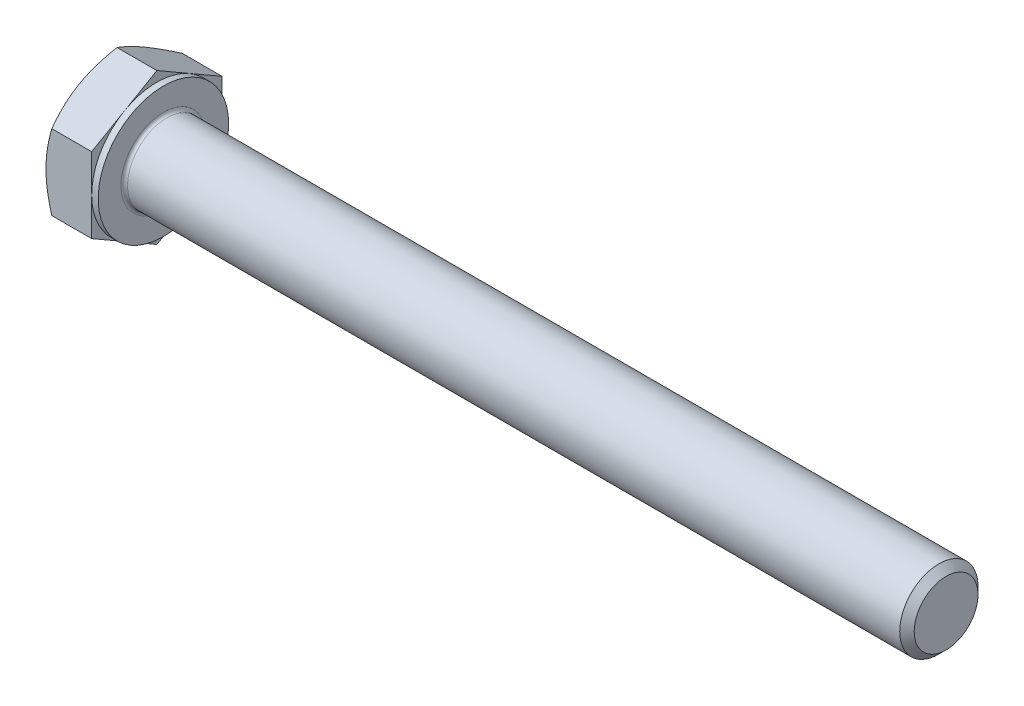
ISO-10303-21;
HEADER;
FILE_DESCRIPTION(('STEP AP214'),'2;1');
FILE_NAME('part.step','',(''),(''),'','','');
FILE_SCHEMA(('AUTOMOTIVE_DESIGN { 1 0 10303 214 1 1 1 1 }'));
ENDSEC;
DATA;
#1=APPLICATION_CONTEXT('core data for automotive mechanical design processes');
#2=APPLICATION_PROTOCOL_DEFINITION('international standard','automotive_design',2000,#1);
#3=PRODUCT_CONTEXT('',#1,'mechanical');
#4=PRODUCT('Part','Part','',(#3));
#5=PRODUCT_RELATED_PRODUCT_CATEGORY('part','',(#4));
#6=PRODUCT_DEFINITION_FORMATION('','',#4);
#7=PRODUCT_DEFINITION_CONTEXT('part definition',#1,'design');
#8=PRODUCT_DEFINITION('design','',#6,#7);
#9=PRODUCT_DEFINITION_SHAPE('','',#8);
#10=(LENGTH_UNIT() NAMED_UNIT(*) SI_UNIT(.MILLI.,.METRE.));
#11=(NAMED_UNIT(*) PLANE_ANGLE_UNIT() SI_UNIT($,.RADIAN.));
#12=(NAMED_UNIT(*) SI_UNIT($,.STERADIAN.) SOLID_ANGLE_UNIT());
#13=UNCERTAINTY_MEASURE_WITH_UNIT(LENGTH_MEASURE(1.E-05),#10,'distance_accuracy_value','');
#14=(GEOMETRIC_REPRESENTATION_CONTEXT(3) GLOBAL_UNCERTAINTY_ASSIGNED_CONTEXT((#13)) GLOBAL_UNIT_ASSIGNED_CONTEXT((#10,
#11,#12)) REPRESENTATION_CONTEXT('',''));
#15=CARTESIAN_POINT('',(0.,0.,0.));
#16=DIRECTION('',(0.,0.,1.));
#17=DIRECTION('',(1.,0.,0.));
#18=AXIS2_PLACEMENT_3D('',#15,#16,#17);
#19=CARTESIAN_POINT('',(4.,5.77350269189626,0.));
#20=DIRECTION('',(1.,0.,0.));
#21=DIRECTION('',(0.,0.,-1.));
#22=AXIS2_PLACEMENT_3D('',#19,#20,#21);
#23=PLANE('',#22);
#24=CARTESIAN_POINT('',(4.,0.,0.));
#25=DIRECTION('',(1.,0.,0.));
#26=DIRECTION('',(0.,0.,-1.));
#27=AXIS2_PLACEMENT_3D('',#24,#25,#26);
#28=CIRCLE('',#27,3.25);
#29=CARTESIAN_POINT('',(4.,0.,-3.25));
#30=VERTEX_POINT('',#29);
#31=EDGE_CURVE('E43',#30,#30,#28,.F.);
#32=ORIENTED_EDGE('',*,*,#31,.T.);
#33=EDGE_LOOP('',(#32));
#34=FACE_BOUND('',#33,.T.);
#35=CARTESIAN_POINT('',(4.,0.,0.));
#36=DIRECTION('',(1.,0.,0.));
#37=DIRECTION('',(0.,0.,-1.));
#38=AXIS2_PLACEMENT_3D('',#35,#36,#37);
#39=CIRCLE('',#38,5.);
#40=CARTESIAN_POINT('',(4.,0.,-5.));
#41=VERTEX_POINT('',#40);
#42=EDGE_CURVE('E300',#41,#41,#39,.T.);
#43=ORIENTED_EDGE('',*,*,#42,.T.);
#44=EDGE_LOOP('',(#43));
#45=FACE_BOUND('',#44,.T.);
#46=ADVANCED_FACE('F35',(#34,#45),#23,.T.);
#47=CARTESIAN_POINT('',(0.,0.,0.));
#48=DIRECTION('',(-1.,0.,0.));
#49=DIRECTION('',(0.,0.,1.));
#50=AXIS2_PLACEMENT_3D('',#47,#48,#49);
#51=CYLINDRICAL_SURFACE('',#50,3.);
#52=CARTESIAN_POINT('',(4.25,0.,0.));
#53=DIRECTION('',(1.,0.,0.));
#54=DIRECTION('',(0.,0.,-1.));
#55=AXIS2_PLACEMENT_3D('',#52,#53,#54);
#56=CIRCLE('',#55,3.);
#57=CARTESIAN_POINT('',(4.25,0.,-3.));
#58=VERTEX_POINT('',#57);
#59=EDGE_CURVE('E11',#58,#58,#56,.T.);
#60=ORIENTED_EDGE('',*,*,#59,.T.);
#61=EDGE_LOOP('',(#60));
#62=FACE_BOUND('',#61,.T.);
#63=CARTESIAN_POINT('',(63.4455,0.,0.));
#64=DIRECTION('',(-1.,0.,0.));
#65=DIRECTION('',(0.,0.,1.));
#66=AXIS2_PLACEMENT_3D('',#63,#64,#65);
#67=CIRCLE('',#66,3.);
#68=CARTESIAN_POINT('',(63.4455,0.,3.));
#69=VERTEX_POINT('',#68);
#70=EDGE_CURVE('E279',#69,#69,#67,.T.);
#71=ORIENTED_EDGE('',*,*,#70,.T.);
#72=EDGE_LOOP('',(#71));
#73=FACE_BOUND('',#72,.T.);
#74=ADVANCED_FACE('F253',(#62,#73),#51,.T.);
#75=CARTESIAN_POINT('',(64.,0.,0.));
#76=DIRECTION('',(-1.,0.,0.));
#77=DIRECTION('',(0.,0.,1.));
#78=AXIS2_PLACEMENT_3D('',#75,#76,#77);
#79=CONICAL_SURFACE('',#78,2.4455,0.785398163397449);
#80=ORIENTED_EDGE('',*,*,#70,.F.);
#81=EDGE_LOOP('',(#80));
#82=FACE_BOUND('',#81,.T.);
#83=CARTESIAN_POINT('',(64.,0.,0.));
#84=DIRECTION('',(-1.,0.,0.));
#85=DIRECTION('',(0.,0.,1.));
#86=AXIS2_PLACEMENT_3D('',#83,#84,#85);
#87=CIRCLE('',#86,2.4455);
#88=CARTESIAN_POINT('',(64.,0.,2.4455));
#89=VERTEX_POINT('',#88);
#90=EDGE_CURVE('E277',#89,#89,#87,.T.);
#91=ORIENTED_EDGE('',*,*,#90,.T.);
#92=EDGE_LOOP('',(#91));
#93=FACE_BOUND('',#92,.T.);
#94=ADVANCED_FACE('F258',(#82,#93),#79,.T.);
#95=CARTESIAN_POINT('',(64.,0.,0.));
#96=DIRECTION('',(-1.,0.,0.));
#97=DIRECTION('',(0.,0.,1.));
#98=AXIS2_PLACEMENT_3D('',#95,#96,#97);
#99=PLANE('',#98);
#100=ORIENTED_EDGE('',*,*,#90,.F.);
#101=EDGE_LOOP('',(#100));
#102=FACE_BOUND('',#101,.T.);
#103=ADVANCED_FACE('F265',(#102),#99,.F.);
#104=CARTESIAN_POINT('',(3.5,5.,0.));
#105=DIRECTION('',(1.,0.,0.));
#106=DIRECTION('',(0.,0.,-1.));
#107=AXIS2_PLACEMENT_3D('',#104,#105,#106);
#108=PLANE('',#107);
#109=DIRECTION('',(0.,0.500000000000001,0.866025403784438));
#110=VECTOR('',#109,1.);
#111=CARTESIAN_POINT('',(3.5,2.88675134594813,-5.));
#112=LINE('',#111,#110);
#113=CARTESIAN_POINT('',(3.5,2.88675134594813,-5.));
#114=VERTEX_POINT('',#113);
#115=CARTESIAN_POINT('',(3.5,4.33012701892219,-2.50000000000001));
#116=VERTEX_POINT('',#115);
#117=EDGE_CURVE('E167',#114,#116,#112,.T.);
#118=ORIENTED_EDGE('',*,*,#117,.T.);
#119=CARTESIAN_POINT('',(3.5,0.,0.));
#120=DIRECTION('',(-1.,0.,0.));
#121=DIRECTION('',(0.,0.,1.));
#122=AXIS2_PLACEMENT_3D('',#119,#120,#121);
#123=CIRCLE('',#122,5.);
#124=CARTESIAN_POINT('',(3.5,0.,-5.));
#125=VERTEX_POINT('',#124);
#126=EDGE_CURVE('E50',#116,#125,#123,.T.);
#127=ORIENTED_EDGE('',*,*,#126,.T.);
#128=DIRECTION('',(0.,1.,0.));
#129=VECTOR('',#128,1.);
#130=CARTESIAN_POINT('',(3.5,2.88675134594813,-5.));
#131=LINE('',#130,#129);
#132=EDGE_CURVE('E303',#125,#114,#131,.T.);
#133=ORIENTED_EDGE('',*,*,#132,.T.);
#134=EDGE_LOOP('',(#118,#127,#133));
#135=FACE_BOUND('',#134,.T.);
#136=ADVANCED_FACE('F268',(#135),#108,.T.);
#137=CARTESIAN_POINT('',(3.5,5.77350269189626,0.));
#138=VERTEX_POINT('',#137);
#139=EDGE_CURVE('E165',#116,#138,#112,.T.);
#140=ORIENTED_EDGE('',*,*,#139,.T.);
#141=DIRECTION('',(0.,-0.500000000000001,0.866025403784438));
#142=VECTOR('',#141,1.);
#143=CARTESIAN_POINT('',(3.5,5.77350269189626,0.));
#144=LINE('',#143,#142);
#145=CARTESIAN_POINT('',(3.5,4.33012701892219,2.5));
#146=VERTEX_POINT('',#145);
#147=EDGE_CURVE('E164',#138,#146,#144,.T.);
#148=ORIENTED_EDGE('',*,*,#147,.T.);
#149=EDGE_CURVE('E153',#146,#116,#123,.T.);
#150=ORIENTED_EDGE('',*,*,#149,.T.);
#151=EDGE_LOOP('',(#140,#148,#150));
#152=FACE_BOUND('',#151,.T.);
#153=ADVANCED_FACE('F273',(#152),#108,.T.);
#154=CARTESIAN_POINT('',(3.5,2.88675134594813,5.));
#155=VERTEX_POINT('',#154);
#156=EDGE_CURVE('E132',#146,#155,#144,.T.);
#157=ORIENTED_EDGE('',*,*,#156,.T.);
#158=DIRECTION('',(0.,-1.,0.));
#159=VECTOR('',#158,1.);
#160=CARTESIAN_POINT('',(3.5,2.88675134594813,5.));
#161=LINE('',#160,#159);
#162=CARTESIAN_POINT('',(3.5,0.,5.));
#163=VERTEX_POINT('',#162);
#164=EDGE_CURVE('E126',#155,#163,#161,.T.);
#165=ORIENTED_EDGE('',*,*,#164,.T.);
#166=EDGE_CURVE('E130',#163,#146,#123,.T.);
#167=ORIENTED_EDGE('',*,*,#166,.T.);
#168=EDGE_LOOP('',(#157,#165,#167));
#169=FACE_BOUND('',#168,.T.);
#170=ADVANCED_FACE('F128',(#169),#108,.T.);
#171=CARTESIAN_POINT('',(3.5,-2.88675134594813,5.));
#172=VERTEX_POINT('',#171);
#173=EDGE_CURVE('E136',#163,#172,#161,.T.);
#174=ORIENTED_EDGE('',*,*,#173,.T.);
#175=DIRECTION('',(0.,-0.500000000000001,-0.866025403784438));
#176=VECTOR('',#175,1.);
#177=CARTESIAN_POINT('',(3.5,-5.77350269189627,0.));
#178=LINE('',#177,#176);
#179=CARTESIAN_POINT('',(3.5,-4.33012701892219,2.5));
#180=VERTEX_POINT('',#179);
#181=EDGE_CURVE('E143',#172,#180,#178,.T.);
#182=ORIENTED_EDGE('',*,*,#181,.T.);
#183=EDGE_CURVE('E140',#180,#163,#123,.T.);
#184=ORIENTED_EDGE('',*,*,#183,.T.);
#185=EDGE_LOOP('',(#174,#182,#184));
#186=FACE_BOUND('',#185,.T.);
#187=ADVANCED_FACE('F141',(#186),#108,.T.);
#188=CARTESIAN_POINT('',(3.5,-5.77350269189627,0.));
#189=VERTEX_POINT('',#188);
#190=EDGE_CURVE('E159',#180,#189,#178,.T.);
#191=ORIENTED_EDGE('',*,*,#190,.T.);
#192=DIRECTION('',(0.,0.5,-0.866025403784438));
#193=VECTOR('',#192,1.);
#194=CARTESIAN_POINT('',(3.5,-2.88675134594814,-5.));
#195=LINE('',#194,#193);
#196=CARTESIAN_POINT('',(3.5,-4.33012701892219,-2.5));
#197=VERTEX_POINT('',#196);
#198=EDGE_CURVE('E341',#189,#197,#195,.T.);
#199=ORIENTED_EDGE('',*,*,#198,.T.);
#200=EDGE_CURVE('E147',#197,#180,#123,.T.);
#201=ORIENTED_EDGE('',*,*,#200,.T.);
#202=EDGE_LOOP('',(#191,#199,#201));
#203=FACE_BOUND('',#202,.T.);
#204=ADVANCED_FACE('F342',(#203),#108,.T.);
#205=CARTESIAN_POINT('',(3.5,-2.88675134594814,-5.));
#206=VERTEX_POINT('',#205);
#207=EDGE_CURVE('E154',#197,#206,#195,.T.);
#208=ORIENTED_EDGE('',*,*,#207,.T.);
#209=EDGE_CURVE('E304',#206,#125,#131,.T.);
#210=ORIENTED_EDGE('',*,*,#209,.T.);
#211=EDGE_CURVE('E311',#125,#197,#123,.T.);
#212=ORIENTED_EDGE('',*,*,#211,.T.);
#213=EDGE_LOOP('',(#208,#210,#212));
#214=FACE_BOUND('',#213,.T.);
#215=ADVANCED_FACE('F274',(#214),#108,.T.);
#216=CARTESIAN_POINT('',(0.,0.,0.));
#217=DIRECTION('',(-1.,0.,0.));
#218=DIRECTION('',(0.,0.,1.));
#219=AXIS2_PLACEMENT_3D('',#216,#217,#218);
#220=CYLINDRICAL_SURFACE('',#219,5.);
#221=ORIENTED_EDGE('',*,*,#126,.F.);
#222=ORIENTED_EDGE('',*,*,#149,.F.);
#223=ORIENTED_EDGE('',*,*,#166,.F.);
#224=ORIENTED_EDGE('',*,*,#183,.F.);
#225=ORIENTED_EDGE('',*,*,#200,.F.);
#226=ORIENTED_EDGE('',*,*,#211,.F.);
#227=EDGE_LOOP('',(#221,#222,#223,#224,#225,#226));
#228=FACE_BOUND('',#227,.T.);
#229=ORIENTED_EDGE('',*,*,#42,.F.);
#230=EDGE_LOOP('',(#229));
#231=FACE_BOUND('',#230,.T.);
#232=ADVANCED_FACE('F150',(#228,#231),#220,.T.);
#233=CARTESIAN_POINT('',(0.,5.77350269189626,0.));
#234=DIRECTION('',(1.,0.,0.));
#235=DIRECTION('',(0.,0.,-1.));
#236=AXIS2_PLACEMENT_3D('',#233,#234,#235);
#237=PLANE('',#236);
#238=CARTESIAN_POINT('',(0.,0.,0.));
#239=DIRECTION('',(1.,0.,0.));
#240=DIRECTION('',(0.,0.,-1.));
#241=AXIS2_PLACEMENT_3D('',#238,#239,#240);
#242=CIRCLE('',#241,5.);
#243=CARTESIAN_POINT('',(0.,0.,-5.));
#244=VERTEX_POINT('',#243);
#245=CARTESIAN_POINT('',(0.,4.33012701892219,-2.50000000000001));
#246=VERTEX_POINT('',#245);
#247=EDGE_CURVE('E299',#244,#246,#242,.T.);
#248=ORIENTED_EDGE('',*,*,#247,.F.);
#249=CARTESIAN_POINT('',(0.,-4.33012701892219,-2.5));
#250=VERTEX_POINT('',#249);
#251=EDGE_CURVE('E295',#250,#244,#242,.T.);
#252=ORIENTED_EDGE('',*,*,#251,.F.);
#253=CARTESIAN_POINT('',(0.,-4.33012701892219,2.5));
#254=VERTEX_POINT('',#253);
#255=EDGE_CURVE('E298',#254,#250,#242,.T.);
#256=ORIENTED_EDGE('',*,*,#255,.F.);
#257=CARTESIAN_POINT('',(0.,0.,5.));
#258=VERTEX_POINT('',#257);
#259=EDGE_CURVE('E334',#258,#254,#242,.T.);
#260=ORIENTED_EDGE('',*,*,#259,.F.);
#261=CARTESIAN_POINT('',(0.,0.,0.));
#262=DIRECTION('',(-1.,0.,0.));
#263=DIRECTION('',(0.,0.,1.));
#264=AXIS2_PLACEMENT_3D('',#261,#262,#263);
#265=CIRCLE('',#264,5.);
#266=CARTESIAN_POINT('',(0.,4.33012701892219,2.50000000000001));
#267=VERTEX_POINT('',#266);
#268=EDGE_CURVE('E168',#258,#267,#265,.T.);
#269=ORIENTED_EDGE('',*,*,#268,.T.);
#270=EDGE_CURVE('E357',#246,#267,#242,.T.);
#271=ORIENTED_EDGE('',*,*,#270,.F.);
#272=EDGE_LOOP('',(#248,#252,#256,#260,#269,#271));
#273=FACE_BOUND('',#272,.T.);
#274=ADVANCED_FACE('F199',(#273),#237,.F.);
#275=CARTESIAN_POINT('',(0.,0.,0.));
#276=DIRECTION('',(1.,0.,0.));
#277=DIRECTION('',(0.,0.,-1.));
#278=AXIS2_PLACEMENT_3D('',#275,#276,#277);
#279=CONICAL_SURFACE('',#278,5.,1.0471975511966);
#280=CARTESIAN_POINT('',(0.446648656051823,2.88663587589429,5.0002));
#281=CARTESIAN_POINT('',(0.373386567637631,3.01349970319368,4.78046540547481));
#282=CARTESIAN_POINT('',(0.306751321918088,3.14144859993849,4.55885141554042));
#283=CARTESIAN_POINT('',(0.190438991010808,3.39956193532121,4.11178600454649));
#284=CARTESIAN_POINT('',(0.140803049915787,3.52973095989718,3.88632664040923));
#285=CARTESIAN_POINT('',(0.0635510254186976,3.78847564779797,3.43816769477649));
#286=CARTESIAN_POINT('',(0.0354203782834899,3.91701101576052,3.21553790689581));
#287=CARTESIAN_POINT('',(0.0101949219536849,4.11026620624322,2.88081009815336));
#288=CARTESIAN_POINT('',(0.00461345976948409,4.17472868879311,2.76915780319494));
#289=CARTESIAN_POINT('',(-0.000797783248529528,4.30371322717528,2.54575002932621));
#290=CARTESIAN_POINT('',(-0.000627741741795967,4.36823528110589,2.43399455370969));
#291=CARTESIAN_POINT('',(0.00775363179203772,4.54500768479194,2.12781576914936));
#292=CARTESIAN_POINT('',(0.0218297718972525,4.65719946015293,1.93349391403279));
#293=CARTESIAN_POINT('',(0.0664652571094314,4.88083840557981,1.5461398980023));
#294=CARTESIAN_POINT('',(0.0970398601475083,4.9922847895602,1.35310909862843));
#295=CARTESIAN_POINT('',(0.173468493621164,5.21637431361295,0.964974657525146));
#296=CARTESIAN_POINT('',(0.21964637887868,5.32898917185759,0.769920001358265));
#297=CARTESIAN_POINT('',(0.324451794491934,5.55253939626499,0.382719654641232));
#298=CARTESIAN_POINT('',(0.383054703437374,5.66347762579592,0.190569004591914));
#299=CARTESIAN_POINT('',(0.446648656051827,5.7736181619501,-0.000199999999999513));
#300=B_SPLINE_CURVE_WITH_KNOTS('',3,(#280,#281,#282,#283,#284,#285,#286,#287,#288,#289,#290,
#291,#292,#293,#294,#295,#296,#297,#298,#299),.UNSPECIFIED.,.F.,.F.,(4,2,2,2,2,2,2,2,2,4),(0.,
0.79255584136309,1.58701660053333,2.3618153748728,2.74884076077325,3.13585419177294,
3.80962362599679,4.48401723901189,5.17336882348929,5.86136694793725),.UNSPECIFIED.);
#301=CARTESIAN_POINT('',(0.446581987385201,5.77350269189626,0.));
#302=VERTEX_POINT('',#301);
#303=EDGE_CURVE('E219',#267,#302,#300,.T.);
#304=ORIENTED_EDGE('',*,*,#303,.T.);
#305=CARTESIAN_POINT('',(0.446648656051827,5.7736181619501,0.000200000000000224));
#306=CARTESIAN_POINT('',(0.373386567637634,5.64675433465071,-0.219534594525185));
#307=CARTESIAN_POINT('',(0.306751321918092,5.5188054379059,-0.44114858445958));
#308=CARTESIAN_POINT('',(0.190438991010811,5.26069210252318,-0.888213995453512));
#309=CARTESIAN_POINT('',(0.140803049915789,5.13052307794721,-1.11367335959077));
#310=CARTESIAN_POINT('',(0.0635510254186983,4.87177839004641,-1.56183230522351));
#311=CARTESIAN_POINT('',(0.0354203782834894,4.74324302208387,-1.78446209310419));
#312=CARTESIAN_POINT('',(0.010194921953685,4.54998783160116,-2.11918990184664));
#313=CARTESIAN_POINT('',(0.00461345976948478,4.48552534905128,-2.23084219680506));
#314=CARTESIAN_POINT('',(-0.000797783248528973,4.35654081066911,-2.4542499706738));
#315=CARTESIAN_POINT('',(-0.000627741741796177,4.2920187567385,-2.56600544629031));
#316=CARTESIAN_POINT('',(0.00775363179203636,4.11524635305244,-2.87218423085064));
#317=CARTESIAN_POINT('',(0.0218297718972514,4.00305457769146,-3.06650608596721));
#318=CARTESIAN_POINT('',(0.0664652571094302,3.77941563226457,-3.4538601019977));
#319=CARTESIAN_POINT('',(0.0970398601475068,3.66796924828418,-3.64689090137157));
#320=CARTESIAN_POINT('',(0.173468493621161,3.44387972423144,-4.03502534247485));
#321=CARTESIAN_POINT('',(0.219646378878677,3.3312648659868,-4.23007999864173));
#322=CARTESIAN_POINT('',(0.32445179449193,3.1077146415794,-4.61728034535877));
#323=CARTESIAN_POINT('',(0.38305470343737,2.99677641204847,-4.80943099540809));
#324=CARTESIAN_POINT('',(0.446648656051824,2.88663587589429,-5.0002));
#325=B_SPLINE_CURVE_WITH_KNOTS('',3,(#305,#306,#307,#308,#309,#310,#311,#312,#313,#314,#315,
#316,#317,#318,#319,#320,#321,#322,#323,#324),.UNSPECIFIED.,.F.,.F.,(4,2,2,2,2,2,2,2,2,4),(0.,
0.79255584136309,1.58701660053333,2.3618153748728,2.74884076077325,3.13585419177295,
3.80962362599679,4.48401723901189,5.17336882348929,5.86136694793726),.UNSPECIFIED.);
#326=EDGE_CURVE('E58',#302,#246,#325,.T.);
#327=ORIENTED_EDGE('',*,*,#326,.T.);
#328=ORIENTED_EDGE('',*,*,#270,.T.);
#329=EDGE_LOOP('',(#304,#327,#328));
#330=FACE_BOUND('',#329,.T.);
#331=ADVANCED_FACE('F358',(#330),#279,.T.);
#332=CARTESIAN_POINT('',(2.47533544773016,-7.82661640485966,5.));
#333=CARTESIAN_POINT('',(2.36879683587998,-7.60758613191208,5.));
#334=CARTESIAN_POINT('',(2.26325911909788,-7.38806071524903,5.));
#335=CARTESIAN_POINT('',(2.05474707935714,-6.94775649684319,5.));
#336=CARTESIAN_POINT('',(1.95177314683289,-6.72697751040762,5.));
#337=CARTESIAN_POINT('',(1.74844778604607,-6.28280027256957,5.));
#338=CARTESIAN_POINT('',(1.64811306546723,-6.05939434718172,5.));
#339=CARTESIAN_POINT('',(1.45145486053268,-5.61083043946536,5.));
#340=CARTESIAN_POINT('',(1.35513119126153,-5.38567253847478,5.));
#341=CARTESIAN_POINT('',(1.16445037644561,-4.92576614875537,5.));
#342=CARTESIAN_POINT('',(1.07026351441087,-4.69094667948418,5.));
#343=CARTESIAN_POINT('',(0.888844387633465,-4.2185875281139,5.));
#344=CARTESIAN_POINT('',(0.801612892890078,-3.9810475481584,5.));
#345=CARTESIAN_POINT('',(0.636341072069418,-3.50329086460758,5.));
#346=CARTESIAN_POINT('',(0.558282765305849,-3.26308044300256,5.));
#347=CARTESIAN_POINT('',(0.413813856838626,-2.77921467855872,5.));
#348=CARTESIAN_POINT('',(0.347399663707796,-2.53556042305535,5.));
#349=CARTESIAN_POINT('',(0.229707450560146,-2.04600448324933,5.));
#350=CARTESIAN_POINT('',(0.178346573443936,-1.80012308688265,5.));
#351=CARTESIAN_POINT('',(0.0936230804633171,-1.305228374755,5.));
#352=CARTESIAN_POINT('',(0.0602585788862647,-1.05621538993014,5.));
#353=CARTESIAN_POINT('',(0.0146229933450849,-0.559584253278234,5.));
#354=CARTESIAN_POINT('',(0.00207498504095111,-0.311992192358639,5.));
#355=CARTESIAN_POINT('',(-0.00159747163599464,0.183375584872585,5.));
#356=CARTESIAN_POINT('',(0.00727849452386872,0.431151304645096,5.));
#357=CARTESIAN_POINT('',(0.0397265054214764,0.849622861805588,5.));
#358=CARTESIAN_POINT('',(0.0579847913857282,1.02075746651638,5.));
#359=CARTESIAN_POINT('',(0.103624050167705,1.36181398870371,5.));
#360=CARTESIAN_POINT('',(0.131006199278084,1.53173574692745,5.));
#361=CARTESIAN_POINT('',(0.225403334084524,2.03942834664788,5.));
#362=CARTESIAN_POINT('',(0.304653621421581,2.37495177296714,5.));
#363=CARTESIAN_POINT('',(0.442611792559001,2.87686006155706,5.));
#364=CARTESIAN_POINT('',(0.492453036342918,3.0458304872064,5.));
#365=CARTESIAN_POINT('',(0.597441969943079,3.38213061181746,5.));
#366=CARTESIAN_POINT('',(0.652589699263441,3.54946029855449,5.));
#367=CARTESIAN_POINT('',(0.767295730539581,3.88253122492364,5.));
#368=CARTESIAN_POINT('',(0.826852713693849,4.04827292290385,5.));
#369=CARTESIAN_POINT('',(0.949663499710998,4.37837269762153,5.));
#370=CARTESIAN_POINT('',(1.01291722698938,4.5427308025697,5.));
#371=CARTESIAN_POINT('',(1.18384085372924,4.97467594201679,5.));
#372=CARTESIAN_POINT('',(1.29410564850766,5.24123504417617,5.));
#373=CARTESIAN_POINT('',(1.5208504127353,5.7717060368554,5.));
#374=CARTESIAN_POINT('',(1.63733099875865,6.03561766166312,5.));
#375=CARTESIAN_POINT('',(1.87507624465413,6.56138078935165,5.));
#376=CARTESIAN_POINT('',(1.99634255400967,6.82323154395422,5.));
#377=CARTESIAN_POINT('',(2.24254703935561,7.34518395756717,5.));
#378=CARTESIAN_POINT('',(2.36748508274945,7.60528567932421,5.));
#379=CARTESIAN_POINT('',(2.62044102963033,8.12446478812678,5.));
#380=CARTESIAN_POINT('',(2.74846325137577,8.38354006704556,5.));
#381=CARTESIAN_POINT('',(3.00682669043526,8.90053291278444,5.));
#382=CARTESIAN_POINT('',(3.13716793150619,9.15845046771046,5.));
#383=CARTESIAN_POINT('',(3.5309242466802,9.93067662423608,5.));
#384=CARTESIAN_POINT('',(3.79712405249166,10.443564725279,5.));
#385=CARTESIAN_POINT('',(4.30724046958685,11.4147548726185,5.));
#386=CARTESIAN_POINT('',(4.55067498840221,11.8733113497711,5.));
#387=CARTESIAN_POINT('',(5.04052915864101,12.7888590482936,5.));
#388=CARTESIAN_POINT('',(5.28694897561914,13.2458501810352,5.));
#389=CARTESIAN_POINT('',(5.78122505426355,14.1571829404852,5.));
#390=CARTESIAN_POINT('',(6.02907430541541,14.6115283754435,5.));
#391=CARTESIAN_POINT('',(6.52648185600864,15.519239876133,5.));
#392=CARTESIAN_POINT('',(6.77604002891257,15.9726060111757,5.));
#393=CARTESIAN_POINT('',(7.02622264640791,16.4256251058944,4.99999999999999));
#394=B_SPLINE_CURVE_WITH_KNOTS('',3,(#332,#333,#334,#335,#336,#337,#338,#339,#340,#341,#342,
#343,#344,#345,#346,#347,#348,#349,#350,#351,#352,#353,#354,#355,#356,#357,#358,#359,#360,#361,
#362,#363,#364,#365,#366,#367,#368,#369,#370,#371,#372,#373,#374,#375,#376,#377,#378,#379,#380,
#381,#382,#383,#384,#385,#386,#387,#388,#389,#390,#391,#392,#393),.UNSPECIFIED.,.F.,.F.,(4,2,2,
2,2,2,2,2,2,2,2,2,2,2,2,2,2,2,2,2,2,2,2,2,2,2,2,2,2,2,4),(0.,0.730708682345172,1.46152797074168,
2.19620403713772,2.93084619629067,3.6897749176122,4.4487875404052,5.20628666357255,
5.96355173652935,6.71656679685729,7.4695029387385,8.21233991499823,8.95519126453254,
9.4712599153487,9.98739512599664,11.0201893970363,11.5486465448551,12.0771076270762,
12.6054112809942,13.1337041368682,13.9989833756252,14.8643486057043,15.7300147495654,
16.5956496701284,17.4625765104336,18.329512236973,20.0630293199505,21.6205191254926,
23.178095703244,24.7307447740735,26.2832800957379),.UNSPECIFIED.);
#395=CARTESIAN_POINT('',(0.446581987385197,2.88675134594813,5.));
#396=VERTEX_POINT('',#395);
#397=EDGE_CURVE('E233',#258,#396,#394,.T.);
#398=ORIENTED_EDGE('',*,*,#397,.T.);
#399=EDGE_CURVE('E232',#396,#267,#300,.T.);
#400=ORIENTED_EDGE('',*,*,#399,.T.);
#401=ORIENTED_EDGE('',*,*,#268,.F.);
#402=EDGE_LOOP('',(#398,#400,#401));
#403=FACE_BOUND('',#402,.T.);
#404=ADVANCED_FACE('F328',(#403),#279,.T.);
#405=CARTESIAN_POINT('',(0.4465819873852,-2.88675134594813,5.));
#406=VERTEX_POINT('',#405);
#407=EDGE_CURVE('E280',#406,#258,#394,.T.);
#408=ORIENTED_EDGE('',*,*,#407,.T.);
#409=ORIENTED_EDGE('',*,*,#259,.T.);
#410=CARTESIAN_POINT('',(0.446648656051831,-5.77361816195011,-0.000199999999999967));
#411=CARTESIAN_POINT('',(0.373386567637638,-5.64675433465072,0.219534594525185));
#412=CARTESIAN_POINT('',(0.306751321918095,-5.51880543790591,0.441148584459581));
#413=CARTESIAN_POINT('',(0.190438991010814,-5.26069210252319,0.888213995453514));
#414=CARTESIAN_POINT('',(0.140803049915793,-5.13052307794722,1.11367335959077));
#415=CARTESIAN_POINT('',(0.0635510254187022,-4.87177839004642,1.56183230522351));
#416=CARTESIAN_POINT('',(0.0354203782834936,-4.74324302208388,1.78446209310419));
#417=CARTESIAN_POINT('',(0.0101949219536883,-4.54998783160117,2.11918990184664));
#418=CARTESIAN_POINT('',(0.00461345976948756,-4.48552534905129,2.23084219680506));
#419=CARTESIAN_POINT('',(-0.000797783248526241,-4.35654081066912,2.4542499706738));
#420=CARTESIAN_POINT('',(-0.000627741741792941,-4.29201875673851,2.56600544629031));
#421=CARTESIAN_POINT('',(0.00775363179204032,-4.11524635305245,2.87218423085064));
#422=CARTESIAN_POINT('',(0.0218297718972551,-4.00305457769147,3.06650608596721));
#423=CARTESIAN_POINT('',(0.0664652571094334,-3.77941563226458,3.45386010199771));
#424=CARTESIAN_POINT('',(0.0970398601475098,-3.66796924828419,3.64689090137157));
#425=CARTESIAN_POINT('',(0.173468493621164,-3.44387972423144,4.03502534247485));
#426=CARTESIAN_POINT('',(0.21964637887868,-3.3312648659868,4.23007999864174));
#427=CARTESIAN_POINT('',(0.324451794491933,-3.10771464157941,4.61728034535877));
#428=CARTESIAN_POINT('',(0.383054703437373,-2.99677641204847,4.80943099540809));
#429=CARTESIAN_POINT('',(0.446648656051826,-2.88663587589429,5.0002));
#430=B_SPLINE_CURVE_WITH_KNOTS('',3,(#410,#411,#412,#413,#414,#415,#416,#417,#418,#419,#420,
#421,#422,#423,#424,#425,#426,#427,#428,#429),.UNSPECIFIED.,.F.,.F.,(4,2,2,2,2,2,2,2,2,4),(0.,
0.792555841363092,1.58701660053333,2.36181537487281,2.74884076077326,3.13585419177295,
3.80962362599679,4.48401723901189,5.17336882348929,5.86136694793726),.UNSPECIFIED.);
#431=EDGE_CURVE('E221',#254,#406,#430,.T.);
#432=ORIENTED_EDGE('',*,*,#431,.T.);
#433=EDGE_LOOP('',(#408,#409,#432));
#434=FACE_BOUND('',#433,.T.);
#435=ADVANCED_FACE('F188',(#434),#279,.T.);
#436=CARTESIAN_POINT('',(0.446581987385204,-5.77350269189627,0.));
#437=VERTEX_POINT('',#436);
#438=EDGE_CURVE('E213',#437,#254,#430,.T.);
#439=ORIENTED_EDGE('',*,*,#438,.T.);
#440=ORIENTED_EDGE('',*,*,#255,.T.);
#441=CARTESIAN_POINT('',(0.446648656051827,-2.8866358758943,-5.0002));
#442=CARTESIAN_POINT('',(0.373386567637634,-3.01349970319369,-4.78046540547482));
#443=CARTESIAN_POINT('',(0.306751321918092,-3.1414485999385,-4.55885141554042));
#444=CARTESIAN_POINT('',(0.190438991010812,-3.39956193532121,-4.11178600454649));
#445=CARTESIAN_POINT('',(0.140803049915791,-3.52973095989718,-3.88632664040923));
#446=CARTESIAN_POINT('',(0.0635510254187009,-3.78847564779798,-3.43816769477649));
#447=CARTESIAN_POINT('',(0.0354203782834928,-3.91701101576052,-3.21553790689581));
#448=CARTESIAN_POINT('',(0.0101949219536886,-4.11026620624323,-2.88081009815336));
#449=CARTESIAN_POINT('',(0.00461345976948829,-4.17472868879311,-2.76915780319494));
#450=CARTESIAN_POINT('',(-0.000797783248525244,-4.30371322717528,-2.5457500293262));
#451=CARTESIAN_POINT('',(-0.000627741741792083,-4.3682352811059,-2.43399455370969));
#452=CARTESIAN_POINT('',(0.00775363179204122,-4.54500768479195,-2.12781576914936));
#453=CARTESIAN_POINT('',(0.0218297718972565,-4.65719946015293,-1.93349391403279));
#454=CARTESIAN_POINT('',(0.0664652571094358,-4.88083840557982,-1.5461398980023));
#455=CARTESIAN_POINT('',(0.0970398601475127,-4.99228478956021,-1.35310909862843));
#456=CARTESIAN_POINT('',(0.173468493621168,-5.21637431361296,-0.964974657525146));
#457=CARTESIAN_POINT('',(0.219646378878684,-5.3289891718576,-0.769920001358265));
#458=CARTESIAN_POINT('',(0.324451794491938,-5.55253939626499,-0.382719654641232));
#459=CARTESIAN_POINT('',(0.383054703437377,-5.66347762579593,-0.190569004591913));
#460=CARTESIAN_POINT('',(0.446648656051831,-5.77361816195011,0.000200000000000339));
#461=B_SPLINE_CURVE_WITH_KNOTS('',3,(#441,#442,#443,#444,#445,#446,#447,#448,#449,#450,#451,
#452,#453,#454,#455,#456,#457,#458,#459,#460),.UNSPECIFIED.,.F.,.F.,(4,2,2,2,2,2,2,2,2,4),(0.,
0.79255584136309,1.58701660053333,2.3618153748728,2.74884076077325,3.13585419177295,
3.80962362599679,4.48401723901189,5.17336882348929,5.86136694793725),.UNSPECIFIED.);
#462=EDGE_CURVE('E220',#250,#437,#461,.T.);
#463=ORIENTED_EDGE('',*,*,#462,.T.);
#464=EDGE_LOOP('',(#439,#440,#463));
#465=FACE_BOUND('',#464,.T.);
#466=ADVANCED_FACE('F356',(#465),#279,.T.);
#467=CARTESIAN_POINT('',(0.446581987385197,2.88675134594813,-5.));
#468=VERTEX_POINT('',#467);
#469=EDGE_CURVE('E222',#246,#468,#325,.T.);
#470=ORIENTED_EDGE('',*,*,#469,.T.);
#471=CARTESIAN_POINT('',(2.47533544773016,-7.82661640485967,-5.));
#472=CARTESIAN_POINT('',(2.36879683587999,-7.60758613191209,-5.));
#473=CARTESIAN_POINT('',(2.26325911909789,-7.38806071524903,-5.));
#474=CARTESIAN_POINT('',(2.05474707935714,-6.9477564968432,-5.));
#475=CARTESIAN_POINT('',(1.95177314683289,-6.72697751040762,-5.));
#476=CARTESIAN_POINT('',(1.74844778604607,-6.28280027256958,-5.));
#477=CARTESIAN_POINT('',(1.64811306546723,-6.05939434718172,-5.));
#478=CARTESIAN_POINT('',(1.45145486053269,-5.61083043946536,-5.));
#479=CARTESIAN_POINT('',(1.35513119126154,-5.38567253847479,-5.));
#480=CARTESIAN_POINT('',(1.16445037644561,-4.92576614875537,-5.));
#481=CARTESIAN_POINT('',(1.07026351441088,-4.69094667948418,-5.));
#482=CARTESIAN_POINT('',(0.888844387633466,-4.2185875281139,-5.));
#483=CARTESIAN_POINT('',(0.801612892890079,-3.98104754815841,-5.));
#484=CARTESIAN_POINT('',(0.636341072069419,-3.50329086460758,-5.));
#485=CARTESIAN_POINT('',(0.55828276530585,-3.26308044300257,-5.));
#486=CARTESIAN_POINT('',(0.413813856838626,-2.77921467855872,-5.));
#487=CARTESIAN_POINT('',(0.347399663707796,-2.53556042305535,-5.));
#488=CARTESIAN_POINT('',(0.229707450560147,-2.04600448324933,-5.));
#489=CARTESIAN_POINT('',(0.178346573443936,-1.80012308688265,-5.));
#490=CARTESIAN_POINT('',(0.0936230804633179,-1.305228374755,-5.));
#491=CARTESIAN_POINT('',(0.0602585788862655,-1.05621538993015,-5.));
#492=CARTESIAN_POINT('',(0.0146229933450854,-0.559584253278235,-5.));
#493=CARTESIAN_POINT('',(0.00207498504095139,-0.311992192358639,-5.));
#494=CARTESIAN_POINT('',(-0.00159747163599442,0.183375584872584,-5.));
#495=CARTESIAN_POINT('',(0.00727849452386907,0.431151304645094,-5.));
#496=CARTESIAN_POINT('',(0.0397265054214767,0.849622861805587,-5.));
#497=CARTESIAN_POINT('',(0.0579847913857285,1.02075746651638,-5.));
#498=CARTESIAN_POINT('',(0.103624050167705,1.36181398870371,-5.));
#499=CARTESIAN_POINT('',(0.131006199278085,1.53173574692745,-5.));
#500=CARTESIAN_POINT('',(0.225403334084525,2.03942834664788,-5.));
#501=CARTESIAN_POINT('',(0.304653621421581,2.37495177296714,-5.));
#502=CARTESIAN_POINT('',(0.442611792559001,2.87686006155706,-5.));
#503=CARTESIAN_POINT('',(0.492453036342918,3.0458304872064,-5.));
#504=CARTESIAN_POINT('',(0.59744196994308,3.38213061181746,-5.));
#505=CARTESIAN_POINT('',(0.652589699263441,3.54946029855449,-5.));
#506=CARTESIAN_POINT('',(0.767295730539581,3.88253122492364,-5.));
#507=CARTESIAN_POINT('',(0.82685271369385,4.04827292290385,-5.));
#508=CARTESIAN_POINT('',(0.949663499710998,4.37837269762153,-5.));
#509=CARTESIAN_POINT('',(1.01291722698938,4.5427308025697,-5.));
#510=CARTESIAN_POINT('',(1.18384085372924,4.97467594201679,-5.));
#511=CARTESIAN_POINT('',(1.29410564850766,5.24123504417617,-5.));
#512=CARTESIAN_POINT('',(1.5208504127353,5.7717060368554,-5.));
#513=CARTESIAN_POINT('',(1.63733099875865,6.03561766166313,-5.));
#514=CARTESIAN_POINT('',(1.87507624465413,6.56138078935165,-5.));
#515=CARTESIAN_POINT('',(1.99634255400967,6.82323154395422,-5.));
#516=CARTESIAN_POINT('',(2.24254703935561,7.34518395756718,-5.));
#517=CARTESIAN_POINT('',(2.36748508274945,7.60528567932421,-5.));
#518=CARTESIAN_POINT('',(2.62044102963033,8.12446478812679,-5.));
#519=CARTESIAN_POINT('',(2.74846325137577,8.38354006704556,-5.));
#520=CARTESIAN_POINT('',(3.00682669043527,8.90053291278444,-5.));
#521=CARTESIAN_POINT('',(3.1371679315062,9.15845046771047,-5.));
#522=CARTESIAN_POINT('',(3.53092424668021,9.93067662423608,-5.));
#523=CARTESIAN_POINT('',(3.79712405249167,10.443564725279,-5.));
#524=CARTESIAN_POINT('',(4.30724046958686,11.4147548726185,-5.));
#525=CARTESIAN_POINT('',(4.55067498840221,11.8733113497711,-5.));
#526=CARTESIAN_POINT('',(5.04052915864102,12.7888590482936,-5.));
#527=CARTESIAN_POINT('',(5.28694897561914,13.2458501810352,-5.));
#528=CARTESIAN_POINT('',(5.78122505426356,14.1571829404852,-5.));
#529=CARTESIAN_POINT('',(6.02907430541541,14.6115283754435,-5.));
#530=CARTESIAN_POINT('',(6.52648185600864,15.519239876133,-5.));
#531=CARTESIAN_POINT('',(6.77604002891257,15.9726060111757,-5.));
#532=CARTESIAN_POINT('',(7.02622264640792,16.4256251058944,-5.));
#533=B_SPLINE_CURVE_WITH_KNOTS('',3,(#471,#472,#473,#474,#475,#476,#477,#478,#479,#480,#481,
#482,#483,#484,#485,#486,#487,#488,#489,#490,#491,#492,#493,#494,#495,#496,#497,#498,#499,#500,
#501,#502,#503,#504,#505,#506,#507,#508,#509,#510,#511,#512,#513,#514,#515,#516,#517,#518,#519,
#520,#521,#522,#523,#524,#525,#526,#527,#528,#529,#530,#531,#532),.UNSPECIFIED.,.F.,.F.,(4,2,2,
2,2,2,2,2,2,2,2,2,2,2,2,2,2,2,2,2,2,2,2,2,2,2,2,2,2,2,4),(0.,0.730708682345174,1.46152797074168,
2.19620403713772,2.93084619629068,3.6897749176122,4.44878754040521,5.20628666357256,
5.96355173652935,6.71656679685729,7.4695029387385,8.21233991499824,8.95519126453255,
9.47125991534871,9.98739512599665,11.0201893970363,11.5486465448551,12.0771076270762,
12.6054112809943,13.1337041368682,13.9989833756253,14.8643486057044,15.7300147495654,
16.5956496701284,17.4625765104337,18.329512236973,20.0630293199506,21.6205191254926,
23.178095703244,24.7307447740736,26.2832800957379),.UNSPECIFIED.);
#534=EDGE_CURVE('E180',#468,#244,#533,.F.);
#535=ORIENTED_EDGE('',*,*,#534,.T.);
#536=ORIENTED_EDGE('',*,*,#247,.T.);
#537=EDGE_LOOP('',(#470,#535,#536));
#538=FACE_BOUND('',#537,.T.);
#539=ADVANCED_FACE('F353',(#538),#279,.T.);
#540=CARTESIAN_POINT('',(0.446581987384946,-2.88675134594852,-5.));
#541=VERTEX_POINT('',#540);
#542=EDGE_CURVE('E181',#541,#250,#461,.T.);
#543=ORIENTED_EDGE('',*,*,#542,.T.);
#544=ORIENTED_EDGE('',*,*,#251,.T.);
#545=EDGE_CURVE('E171',#244,#541,#533,.F.);
#546=ORIENTED_EDGE('',*,*,#545,.T.);
#547=EDGE_LOOP('',(#543,#544,#546));
#548=FACE_BOUND('',#547,.T.);
#549=ADVANCED_FACE('F197',(#548),#279,.T.);
#550=CARTESIAN_POINT('',(4.,2.88675134594813,-5.));
#551=DIRECTION('',(0.,0.,1.));
#552=DIRECTION('',(0.,-1.,0.));
#553=AXIS2_PLACEMENT_3D('',#550,#551,#552);
#554=PLANE('',#553);
#555=ORIENTED_EDGE('',*,*,#209,.F.);
#556=DIRECTION('',(-1.,0.,0.));
#557=VECTOR('',#556,1.);
#558=CARTESIAN_POINT('',(4.,-2.88675134594814,-5.));
#559=LINE('',#558,#557);
#560=EDGE_CURVE('E286',#206,#541,#559,.T.);
#561=ORIENTED_EDGE('',*,*,#560,.T.);
#562=ORIENTED_EDGE('',*,*,#545,.F.);
#563=ORIENTED_EDGE('',*,*,#534,.F.);
#564=DIRECTION('',(-1.,0.,0.));
#565=VECTOR('',#564,1.);
#566=CARTESIAN_POINT('',(4.,2.88675134594813,-5.));
#567=LINE('',#566,#565);
#568=EDGE_CURVE('E282',#114,#468,#567,.T.);
#569=ORIENTED_EDGE('',*,*,#568,.F.);
#570=ORIENTED_EDGE('',*,*,#132,.F.);
#571=EDGE_LOOP('',(#555,#561,#562,#563,#569,#570));
#572=FACE_BOUND('',#571,.T.);
#573=ADVANCED_FACE('F192',(#572),#554,.F.);
#574=CARTESIAN_POINT('',(4.,-2.88675134594814,-5.));
#575=DIRECTION('',(0.,0.866025403784438,0.5));
#576=DIRECTION('',(0.,-0.5,0.866025403784438));
#577=AXIS2_PLACEMENT_3D('',#574,#575,#576);
#578=PLANE('',#577);
#579=ORIENTED_EDGE('',*,*,#198,.F.);
#580=DIRECTION('',(-1.,0.,0.));
#581=VECTOR('',#580,1.);
#582=CARTESIAN_POINT('',(4.,-5.77350269189627,0.));
#583=LINE('',#582,#581);
#584=EDGE_CURVE('E288',#189,#437,#583,.T.);
#585=ORIENTED_EDGE('',*,*,#584,.T.);
#586=ORIENTED_EDGE('',*,*,#462,.F.);
#587=ORIENTED_EDGE('',*,*,#542,.F.);
#588=ORIENTED_EDGE('',*,*,#560,.F.);
#589=ORIENTED_EDGE('',*,*,#207,.F.);
#590=EDGE_LOOP('',(#579,#585,#586,#587,#588,#589));
#591=FACE_BOUND('',#590,.T.);
#592=ADVANCED_FACE('F196',(#591),#578,.F.);
#593=CARTESIAN_POINT('',(4.,-5.77350269189627,0.));
#594=DIRECTION('',(0.,0.866025403784438,-0.500000000000001));
#595=DIRECTION('',(0.,0.500000000000001,0.866025403784438));
#596=AXIS2_PLACEMENT_3D('',#593,#594,#595);
#597=PLANE('',#596);
#598=ORIENTED_EDGE('',*,*,#181,.F.);
#599=DIRECTION('',(-1.,0.,0.));
#600=VECTOR('',#599,1.);
#601=CARTESIAN_POINT('',(4.,-2.88675134594813,5.));
#602=LINE('',#601,#600);
#603=EDGE_CURVE('E158',#172,#406,#602,.T.);
#604=ORIENTED_EDGE('',*,*,#603,.T.);
#605=ORIENTED_EDGE('',*,*,#431,.F.);
#606=ORIENTED_EDGE('',*,*,#438,.F.);
#607=ORIENTED_EDGE('',*,*,#584,.F.);
#608=ORIENTED_EDGE('',*,*,#190,.F.);
#609=EDGE_LOOP('',(#598,#604,#605,#606,#607,#608));
#610=FACE_BOUND('',#609,.T.);
#611=ADVANCED_FACE('F204',(#610),#597,.F.);
#612=CARTESIAN_POINT('',(4.,2.88675134594813,5.));
#613=DIRECTION('',(0.,0.,-1.));
#614=DIRECTION('',(0.,1.,0.));
#615=AXIS2_PLACEMENT_3D('',#612,#613,#614);
#616=PLANE('',#615);
#617=ORIENTED_EDGE('',*,*,#164,.F.);
#618=DIRECTION('',(-1.,0.,0.));
#619=VECTOR('',#618,1.);
#620=CARTESIAN_POINT('',(4.,2.88675134594813,5.));
#621=LINE('',#620,#619);
#622=EDGE_CURVE('E291',#155,#396,#621,.T.);
#623=ORIENTED_EDGE('',*,*,#622,.T.);
#624=ORIENTED_EDGE('',*,*,#397,.F.);
#625=ORIENTED_EDGE('',*,*,#407,.F.);
#626=ORIENTED_EDGE('',*,*,#603,.F.);
#627=ORIENTED_EDGE('',*,*,#173,.F.);
#628=EDGE_LOOP('',(#617,#623,#624,#625,#626,#627));
#629=FACE_BOUND('',#628,.T.);
#630=ADVANCED_FACE('F156',(#629),#616,.F.);
#631=CARTESIAN_POINT('',(4.,5.77350269189626,0.));
#632=DIRECTION('',(0.,-0.866025403784438,-0.500000000000001));
#633=DIRECTION('',(0.,0.500000000000001,-0.866025403784438));
#634=AXIS2_PLACEMENT_3D('',#631,#632,#633);
#635=PLANE('',#634);
#636=ORIENTED_EDGE('',*,*,#147,.F.);
#637=DIRECTION('',(-1.,0.,0.));
#638=VECTOR('',#637,1.);
#639=CARTESIAN_POINT('',(4.,5.77350269189626,0.));
#640=LINE('',#639,#638);
#641=EDGE_CURVE('E293',#138,#302,#640,.T.);
#642=ORIENTED_EDGE('',*,*,#641,.T.);
#643=ORIENTED_EDGE('',*,*,#303,.F.);
#644=ORIENTED_EDGE('',*,*,#399,.F.);
#645=ORIENTED_EDGE('',*,*,#622,.F.);
#646=ORIENTED_EDGE('',*,*,#156,.F.);
#647=EDGE_LOOP('',(#636,#642,#643,#644,#645,#646));
#648=FACE_BOUND('',#647,.T.);
#649=ADVANCED_FACE('F239',(#648),#635,.F.);
#650=CARTESIAN_POINT('',(4.,2.88675134594813,-5.));
#651=DIRECTION('',(0.,-0.866025403784438,0.500000000000001));
#652=DIRECTION('',(0.,-0.500000000000001,-0.866025403784438));
#653=AXIS2_PLACEMENT_3D('',#650,#651,#652);
#654=PLANE('',#653);
#655=ORIENTED_EDGE('',*,*,#117,.F.);
#656=ORIENTED_EDGE('',*,*,#568,.T.);
#657=ORIENTED_EDGE('',*,*,#469,.F.);
#658=ORIENTED_EDGE('',*,*,#326,.F.);
#659=ORIENTED_EDGE('',*,*,#641,.F.);
#660=ORIENTED_EDGE('',*,*,#139,.F.);
#661=EDGE_LOOP('',(#655,#656,#657,#658,#659,#660));
#662=FACE_BOUND('',#661,.T.);
#663=ADVANCED_FACE('F242',(#662),#654,.F.);
#664=CARTESIAN_POINT('',(4.25,0.,0.));
#665=DIRECTION('',(1.,0.,0.));
#666=DIRECTION('',(0.,0.,-1.));
#667=AXIS2_PLACEMENT_3D('',#664,#665,#666);
#668=TOROIDAL_SURFACE('',#667,3.25,0.25);
#669=ORIENTED_EDGE('',*,*,#59,.F.);
#670=EDGE_LOOP('',(#669));
#671=FACE_BOUND('',#670,.T.);
#672=ORIENTED_EDGE('',*,*,#31,.F.);
#673=EDGE_LOOP('',(#672));
#674=FACE_BOUND('',#673,.T.);
#675=ADVANCED_FACE('F37',(#671,#674),#668,.F.);
#676=CLOSED_SHELL('',(#46,#74,#94,#103,#136,#153,#170,#187,#204,#215,#232,#274,#331,#404,#435,
#466,#539,#549,#573,#592,#611,#630,#649,#663,#675));
#677=MANIFOLD_SOLID_BREP('B2',#676);
#678=ADVANCED_BREP_SHAPE_REPRESENTATION('',(#18,#677),#14);
#679=SHAPE_DEFINITION_REPRESENTATION(#9,#678);
ENDSEC;
END-ISO-10303-21;
